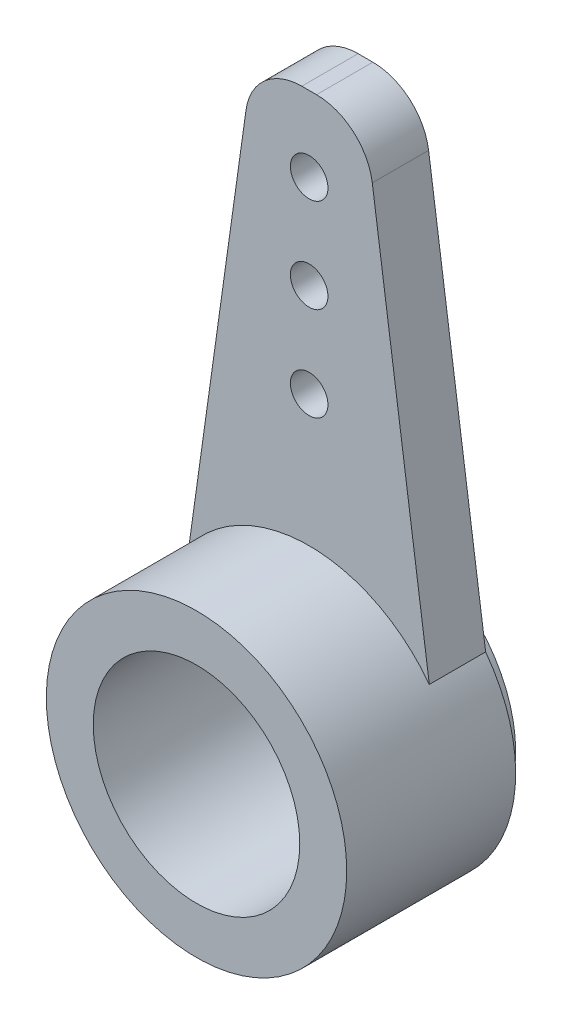
ISO-10303-21;
HEADER;
FILE_DESCRIPTION(('STEP AP214'),'2;1');
FILE_NAME('part.step','',(''),(''),'','','');
FILE_SCHEMA(('AUTOMOTIVE_DESIGN { 1 0 10303 214 1 1 1 1 }'));
ENDSEC;
DATA;
#1=APPLICATION_CONTEXT('core data for automotive mechanical design processes');
#2=APPLICATION_PROTOCOL_DEFINITION('international standard','automotive_design',2000,#1);
#3=PRODUCT_CONTEXT('',#1,'mechanical');
#4=PRODUCT('Part','Part','',(#3));
#5=PRODUCT_RELATED_PRODUCT_CATEGORY('part','',(#4));
#6=PRODUCT_DEFINITION_FORMATION('','',#4);
#7=PRODUCT_DEFINITION_CONTEXT('part definition',#1,'design');
#8=PRODUCT_DEFINITION('design','',#6,#7);
#9=PRODUCT_DEFINITION_SHAPE('','',#8);
#10=(LENGTH_UNIT() NAMED_UNIT(*) SI_UNIT(.MILLI.,.METRE.));
#11=(NAMED_UNIT(*) PLANE_ANGLE_UNIT() SI_UNIT($,.RADIAN.));
#12=(NAMED_UNIT(*) SI_UNIT($,.STERADIAN.) SOLID_ANGLE_UNIT());
#13=UNCERTAINTY_MEASURE_WITH_UNIT(LENGTH_MEASURE(1.E-05),#10,'distance_accuracy_value','');
#14=(GEOMETRIC_REPRESENTATION_CONTEXT(3) GLOBAL_UNCERTAINTY_ASSIGNED_CONTEXT((#13)) GLOBAL_UNIT_ASSIGNED_CONTEXT((#10,
#11,#12)) REPRESENTATION_CONTEXT('',''));
#15=CARTESIAN_POINT('',(0.,0.,0.));
#16=DIRECTION('',(0.,0.,1.));
#17=DIRECTION('',(1.,0.,0.));
#18=AXIS2_PLACEMENT_3D('',#15,#16,#17);
#19=CARTESIAN_POINT('',(0.,0.,1.5));
#20=DIRECTION('',(0.,0.,-1.));
#21=DIRECTION('',(-1.,0.,0.));
#22=AXIS2_PLACEMENT_3D('',#19,#20,#21);
#23=CYLINDRICAL_SURFACE('',#22,1.5);
#24=CARTESIAN_POINT('',(0.,0.,0.));
#25=DIRECTION('',(0.,0.,1.));
#26=DIRECTION('',(1.,0.,0.));
#27=AXIS2_PLACEMENT_3D('',#24,#25,#26);
#28=CIRCLE('',#27,1.5);
#29=CARTESIAN_POINT('',(1.5,0.,0.));
#30=VERTEX_POINT('',#29);
#31=EDGE_CURVE('E122',#30,#30,#28,.T.);
#32=ORIENTED_EDGE('',*,*,#31,.F.);
#33=EDGE_LOOP('',(#32));
#34=FACE_BOUND('',#33,.T.);
#35=CARTESIAN_POINT('',(0.,0.,0.5));
#36=DIRECTION('',(0.,0.,1.));
#37=DIRECTION('',(1.,0.,0.));
#38=AXIS2_PLACEMENT_3D('',#35,#36,#37);
#39=CIRCLE('',#38,1.5);
#40=CARTESIAN_POINT('',(1.5,0.,0.5));
#41=VERTEX_POINT('',#40);
#42=EDGE_CURVE('E36',#41,#41,#39,.T.);
#43=ORIENTED_EDGE('',*,*,#42,.T.);
#44=EDGE_LOOP('',(#43));
#45=FACE_BOUND('',#44,.T.);
#46=ADVANCED_FACE('F32',(#34,#45),#23,.F.);
#47=CARTESIAN_POINT('',(0.,0.,1.5));
#48=DIRECTION('',(0.,0.,1.));
#49=DIRECTION('',(1.,0.,0.));
#50=AXIS2_PLACEMENT_3D('',#47,#48,#49);
#51=PLANE('',#50);
#52=CARTESIAN_POINT('',(0.,0.,1.5));
#53=DIRECTION('',(0.,0.,1.));
#54=DIRECTION('',(1.,0.,0.));
#55=AXIS2_PLACEMENT_3D('',#52,#53,#54);
#56=CIRCLE('',#55,4.);
#57=CARTESIAN_POINT('',(3.2,2.4,1.5));
#58=VERTEX_POINT('',#57);
#59=CARTESIAN_POINT('',(-3.2,2.4,1.5));
#60=VERTEX_POINT('',#59);
#61=EDGE_CURVE('E172',#58,#60,#56,.T.);
#62=ORIENTED_EDGE('',*,*,#61,.F.);
#63=DIRECTION('',(-0.139129433730637,0.99027420478865,0.));
#64=VECTOR('',#63,1.);
#65=CARTESIAN_POINT('',(3.2,2.4,1.5));
#66=LINE('',#65,#64);
#67=CARTESIAN_POINT('',(1.68142313586669,13.2086941505959,1.5));
#68=VERTEX_POINT('',#67);
#69=EDGE_CURVE('E87',#58,#68,#66,.T.);
#70=ORIENTED_EDGE('',*,*,#69,.T.);
#71=CARTESIAN_POINT('',(0.196011828683711,13.,1.5));
#72=DIRECTION('',(0.,0.,1.));
#73=DIRECTION('',(1.,0.,0.));
#74=AXIS2_PLACEMENT_3D('',#71,#72,#73);
#75=CIRCLE('',#74,1.5);
#76=CARTESIAN_POINT('',(0.196011828683702,14.5,1.5));
#77=VERTEX_POINT('',#76);
#78=EDGE_CURVE('E100',#68,#77,#75,.T.);
#79=ORIENTED_EDGE('',*,*,#78,.T.);
#80=DIRECTION('',(-1.,0.,0.));
#81=VECTOR('',#80,1.);
#82=CARTESIAN_POINT('',(-0.196011828683702,14.5,1.5));
#83=LINE('',#82,#81);
#84=CARTESIAN_POINT('',(-0.196011828683702,14.5,1.5));
#85=VERTEX_POINT('',#84);
#86=EDGE_CURVE('E93',#77,#85,#83,.T.);
#87=ORIENTED_EDGE('',*,*,#86,.T.);
#88=CARTESIAN_POINT('',(-0.196011828683711,13.,1.5));
#89=DIRECTION('',(0.,0.,1.));
#90=DIRECTION('',(1.,0.,0.));
#91=AXIS2_PLACEMENT_3D('',#88,#89,#90);
#92=CIRCLE('',#91,1.5);
#93=CARTESIAN_POINT('',(-1.68142313586669,13.2086941505959,1.5));
#94=VERTEX_POINT('',#93);
#95=EDGE_CURVE('E98',#85,#94,#92,.T.);
#96=ORIENTED_EDGE('',*,*,#95,.T.);
#97=DIRECTION('',(-0.139129433730637,-0.99027420478865,0.));
#98=VECTOR('',#97,1.);
#99=CARTESIAN_POINT('',(-3.2,2.4,1.5));
#100=LINE('',#99,#98);
#101=EDGE_CURVE('E50',#94,#60,#100,.T.);
#102=ORIENTED_EDGE('',*,*,#101,.T.);
#103=EDGE_LOOP('',(#62,#70,#79,#87,#96,#102));
#104=FACE_BOUND('',#103,.T.);
#105=CARTESIAN_POINT('',(0.,12.5,1.5));
#106=DIRECTION('',(0.,0.,1.));
#107=DIRECTION('',(1.,0.,0.));
#108=AXIS2_PLACEMENT_3D('',#105,#106,#107);
#109=CIRCLE('',#108,0.5);
#110=CARTESIAN_POINT('',(0.5,12.5,1.5));
#111=VERTEX_POINT('',#110);
#112=EDGE_CURVE('E157',#111,#111,#109,.T.);
#113=ORIENTED_EDGE('',*,*,#112,.F.);
#114=EDGE_LOOP('',(#113));
#115=FACE_BOUND('',#114,.T.);
#116=CARTESIAN_POINT('',(0.,10.,1.5));
#117=DIRECTION('',(0.,0.,1.));
#118=DIRECTION('',(1.,0.,0.));
#119=AXIS2_PLACEMENT_3D('',#116,#117,#118);
#120=CIRCLE('',#119,0.5);
#121=CARTESIAN_POINT('',(0.5,10.,1.5));
#122=VERTEX_POINT('',#121);
#123=EDGE_CURVE('E153',#122,#122,#120,.T.);
#124=ORIENTED_EDGE('',*,*,#123,.F.);
#125=EDGE_LOOP('',(#124));
#126=FACE_BOUND('',#125,.T.);
#127=CARTESIAN_POINT('',(0.,7.5,1.5));
#128=DIRECTION('',(0.,0.,1.));
#129=DIRECTION('',(1.,0.,0.));
#130=AXIS2_PLACEMENT_3D('',#127,#128,#129);
#131=CIRCLE('',#130,0.5);
#132=CARTESIAN_POINT('',(0.5,7.5,1.5));
#133=VERTEX_POINT('',#132);
#134=EDGE_CURVE('E163',#133,#133,#131,.T.);
#135=ORIENTED_EDGE('',*,*,#134,.F.);
#136=EDGE_LOOP('',(#135));
#137=FACE_BOUND('',#136,.T.);
#138=ADVANCED_FACE('F95',(#104,#115,#126,#137),#51,.T.);
#139=CARTESIAN_POINT('',(0.,0.,0.));
#140=DIRECTION('',(0.,0.,1.));
#141=DIRECTION('',(1.,0.,0.));
#142=AXIS2_PLACEMENT_3D('',#139,#140,#141);
#143=PLANE('',#142);
#144=CARTESIAN_POINT('',(0.,0.,0.));
#145=DIRECTION('',(0.,0.,1.));
#146=DIRECTION('',(1.,0.,0.));
#147=AXIS2_PLACEMENT_3D('',#144,#145,#146);
#148=CIRCLE('',#147,3.5);
#149=CARTESIAN_POINT('',(3.5,0.,0.));
#150=VERTEX_POINT('',#149);
#151=EDGE_CURVE('E11',#150,#150,#148,.F.);
#152=ORIENTED_EDGE('',*,*,#151,.F.);
#153=EDGE_LOOP('',(#152));
#154=FACE_BOUND('',#153,.T.);
#155=CARTESIAN_POINT('',(0.,0.,0.));
#156=DIRECTION('',(0.,0.,1.));
#157=DIRECTION('',(1.,0.,0.));
#158=AXIS2_PLACEMENT_3D('',#155,#156,#157);
#159=CIRCLE('',#158,4.);
#160=CARTESIAN_POINT('',(-3.2,2.4,0.));
#161=VERTEX_POINT('',#160);
#162=CARTESIAN_POINT('',(3.2,2.4,0.));
#163=VERTEX_POINT('',#162);
#164=EDGE_CURVE('E118',#161,#163,#159,.T.);
#165=ORIENTED_EDGE('',*,*,#164,.F.);
#166=DIRECTION('',(-0.139129433730637,-0.99027420478865,0.));
#167=VECTOR('',#166,1.);
#168=CARTESIAN_POINT('',(-3.2,2.4,0.));
#169=LINE('',#168,#167);
#170=CARTESIAN_POINT('',(-1.68142313586669,13.2086941505959,0.));
#171=VERTEX_POINT('',#170);
#172=EDGE_CURVE('E80',#171,#161,#169,.T.);
#173=ORIENTED_EDGE('',*,*,#172,.F.);
#174=CARTESIAN_POINT('',(-0.196011828683711,13.,0.));
#175=DIRECTION('',(0.,0.,1.));
#176=DIRECTION('',(1.,0.,0.));
#177=AXIS2_PLACEMENT_3D('',#174,#175,#176);
#178=CIRCLE('',#177,1.5);
#179=CARTESIAN_POINT('',(-0.196011828683702,14.5,0.));
#180=VERTEX_POINT('',#179);
#181=EDGE_CURVE('E74',#180,#171,#178,.T.);
#182=ORIENTED_EDGE('',*,*,#181,.F.);
#183=DIRECTION('',(-1.,0.,0.));
#184=VECTOR('',#183,1.);
#185=CARTESIAN_POINT('',(-0.196011828683702,14.5,0.));
#186=LINE('',#185,#184);
#187=CARTESIAN_POINT('',(0.196011828683702,14.5,0.));
#188=VERTEX_POINT('',#187);
#189=EDGE_CURVE('E108',#188,#180,#186,.T.);
#190=ORIENTED_EDGE('',*,*,#189,.F.);
#191=CARTESIAN_POINT('',(0.196011828683711,13.,0.));
#192=DIRECTION('',(0.,0.,1.));
#193=DIRECTION('',(1.,0.,0.));
#194=AXIS2_PLACEMENT_3D('',#191,#192,#193);
#195=CIRCLE('',#194,1.5);
#196=CARTESIAN_POINT('',(1.68142313586669,13.2086941505959,0.));
#197=VERTEX_POINT('',#196);
#198=EDGE_CURVE('E124',#197,#188,#195,.T.);
#199=ORIENTED_EDGE('',*,*,#198,.F.);
#200=DIRECTION('',(-0.139129433730637,0.99027420478865,0.));
#201=VECTOR('',#200,1.);
#202=CARTESIAN_POINT('',(3.2,2.4,0.));
#203=LINE('',#202,#201);
#204=EDGE_CURVE('E121',#163,#197,#203,.T.);
#205=ORIENTED_EDGE('',*,*,#204,.F.);
#206=EDGE_LOOP('',(#165,#173,#182,#190,#199,#205));
#207=FACE_BOUND('',#206,.T.);
#208=CARTESIAN_POINT('',(0.,10.,0.));
#209=DIRECTION('',(0.,0.,1.));
#210=DIRECTION('',(1.,0.,0.));
#211=AXIS2_PLACEMENT_3D('',#208,#209,#210);
#212=CIRCLE('',#211,0.5);
#213=CARTESIAN_POINT('',(0.5,10.,0.));
#214=VERTEX_POINT('',#213);
#215=EDGE_CURVE('E154',#214,#214,#212,.T.);
#216=ORIENTED_EDGE('',*,*,#215,.T.);
#217=EDGE_LOOP('',(#216));
#218=FACE_BOUND('',#217,.T.);
#219=CARTESIAN_POINT('',(0.,12.5,0.));
#220=DIRECTION('',(0.,0.,1.));
#221=DIRECTION('',(1.,0.,0.));
#222=AXIS2_PLACEMENT_3D('',#219,#220,#221);
#223=CIRCLE('',#222,0.5);
#224=CARTESIAN_POINT('',(0.5,12.5,0.));
#225=VERTEX_POINT('',#224);
#226=EDGE_CURVE('E160',#225,#225,#223,.T.);
#227=ORIENTED_EDGE('',*,*,#226,.T.);
#228=EDGE_LOOP('',(#227));
#229=FACE_BOUND('',#228,.T.);
#230=CARTESIAN_POINT('',(0.,7.5,0.));
#231=DIRECTION('',(0.,0.,1.));
#232=DIRECTION('',(1.,0.,0.));
#233=AXIS2_PLACEMENT_3D('',#230,#231,#232);
#234=CIRCLE('',#233,0.5);
#235=CARTESIAN_POINT('',(0.5,7.5,0.));
#236=VERTEX_POINT('',#235);
#237=EDGE_CURVE('E166',#236,#236,#234,.T.);
#238=ORIENTED_EDGE('',*,*,#237,.T.);
#239=EDGE_LOOP('',(#238));
#240=FACE_BOUND('',#239,.T.);
#241=ADVANCED_FACE('F144',(#154,#207,#218,#229,#240),#143,.F.);
#242=CARTESIAN_POINT('',(0.,0.,1.5));
#243=DIRECTION('',(0.,0.,-1.));
#244=DIRECTION('',(-1.,0.,0.));
#245=AXIS2_PLACEMENT_3D('',#242,#243,#244);
#246=CYLINDRICAL_SURFACE('',#245,4.);
#247=ORIENTED_EDGE('',*,*,#164,.T.);
#248=DIRECTION('',(0.,0.,-1.));
#249=VECTOR('',#248,1.);
#250=CARTESIAN_POINT('',(3.2,2.4,1.5));
#251=LINE('',#250,#249);
#252=EDGE_CURVE('E42',#58,#163,#251,.T.);
#253=ORIENTED_EDGE('',*,*,#252,.F.);
#254=ORIENTED_EDGE('',*,*,#61,.T.);
#255=DIRECTION('',(0.,0.,-1.));
#256=VECTOR('',#255,1.);
#257=CARTESIAN_POINT('',(-3.2,2.4,1.5));
#258=LINE('',#257,#256);
#259=EDGE_CURVE('E114',#60,#161,#258,.T.);
#260=ORIENTED_EDGE('',*,*,#259,.T.);
#261=EDGE_LOOP('',(#247,#253,#254,#260));
#262=FACE_BOUND('',#261,.T.);
#263=CARTESIAN_POINT('',(0.,0.,4.5));
#264=DIRECTION('',(0.,0.,1.));
#265=DIRECTION('',(1.,0.,0.));
#266=AXIS2_PLACEMENT_3D('',#263,#264,#265);
#267=CIRCLE('',#266,4.);
#268=CARTESIAN_POINT('',(4.,0.,4.5));
#269=VERTEX_POINT('',#268);
#270=EDGE_CURVE('E169',#269,#269,#267,.T.);
#271=ORIENTED_EDGE('',*,*,#270,.F.);
#272=EDGE_LOOP('',(#271));
#273=FACE_BOUND('',#272,.T.);
#274=ADVANCED_FACE('F34',(#262,#273),#246,.T.);
#275=CARTESIAN_POINT('',(3.2,2.4,1.5));
#276=DIRECTION('',(-0.99027420478865,-0.139129433730637,0.));
#277=DIRECTION('',(0.139129433730637,-0.99027420478865,0.));
#278=AXIS2_PLACEMENT_3D('',#275,#276,#277);
#279=PLANE('',#278);
#280=ORIENTED_EDGE('',*,*,#204,.T.);
#281=DIRECTION('',(0.,0.,-1.));
#282=VECTOR('',#281,1.);
#283=CARTESIAN_POINT('',(1.68142313586669,13.2086941505959,1.5));
#284=LINE('',#283,#282);
#285=EDGE_CURVE('E132',#68,#197,#284,.T.);
#286=ORIENTED_EDGE('',*,*,#285,.F.);
#287=ORIENTED_EDGE('',*,*,#69,.F.);
#288=ORIENTED_EDGE('',*,*,#252,.T.);
#289=EDGE_LOOP('',(#280,#286,#287,#288));
#290=FACE_BOUND('',#289,.T.);
#291=ADVANCED_FACE('F138',(#290),#279,.F.);
#292=CARTESIAN_POINT('',(0.196011828683711,13.,1.5));
#293=DIRECTION('',(0.,0.,-1.));
#294=DIRECTION('',(-1.,0.,0.));
#295=AXIS2_PLACEMENT_3D('',#292,#293,#294);
#296=CYLINDRICAL_SURFACE('',#295,1.5);
#297=ORIENTED_EDGE('',*,*,#198,.T.);
#298=DIRECTION('',(0.,0.,-1.));
#299=VECTOR('',#298,1.);
#300=CARTESIAN_POINT('',(0.196011828683702,14.5,1.5));
#301=LINE('',#300,#299);
#302=EDGE_CURVE('E109',#77,#188,#301,.T.);
#303=ORIENTED_EDGE('',*,*,#302,.F.);
#304=ORIENTED_EDGE('',*,*,#78,.F.);
#305=ORIENTED_EDGE('',*,*,#285,.T.);
#306=EDGE_LOOP('',(#297,#303,#304,#305));
#307=FACE_BOUND('',#306,.T.);
#308=ADVANCED_FACE('F148',(#307),#296,.T.);
#309=CARTESIAN_POINT('',(-0.196011828683702,14.5,1.5));
#310=DIRECTION('',(0.,-1.,0.));
#311=DIRECTION('',(0.,0.,-1.));
#312=AXIS2_PLACEMENT_3D('',#309,#310,#311);
#313=PLANE('',#312);
#314=ORIENTED_EDGE('',*,*,#189,.T.);
#315=DIRECTION('',(0.,0.,-1.));
#316=VECTOR('',#315,1.);
#317=CARTESIAN_POINT('',(-0.196011828683702,14.5,1.5));
#318=LINE('',#317,#316);
#319=EDGE_CURVE('E105',#85,#180,#318,.T.);
#320=ORIENTED_EDGE('',*,*,#319,.F.);
#321=ORIENTED_EDGE('',*,*,#86,.F.);
#322=ORIENTED_EDGE('',*,*,#302,.T.);
#323=EDGE_LOOP('',(#314,#320,#321,#322));
#324=FACE_BOUND('',#323,.T.);
#325=ADVANCED_FACE('F106',(#324),#313,.F.);
#326=CARTESIAN_POINT('',(-0.196011828683711,13.,1.5));
#327=DIRECTION('',(0.,0.,-1.));
#328=DIRECTION('',(-1.,0.,0.));
#329=AXIS2_PLACEMENT_3D('',#326,#327,#328);
#330=CYLINDRICAL_SURFACE('',#329,1.5);
#331=ORIENTED_EDGE('',*,*,#181,.T.);
#332=DIRECTION('',(0.,0.,-1.));
#333=VECTOR('',#332,1.);
#334=CARTESIAN_POINT('',(-1.68142313586669,13.2086941505959,1.5));
#335=LINE('',#334,#333);
#336=EDGE_CURVE('E110',#94,#171,#335,.T.);
#337=ORIENTED_EDGE('',*,*,#336,.F.);
#338=ORIENTED_EDGE('',*,*,#95,.F.);
#339=ORIENTED_EDGE('',*,*,#319,.T.);
#340=EDGE_LOOP('',(#331,#337,#338,#339));
#341=FACE_BOUND('',#340,.T.);
#342=ADVANCED_FACE('F112',(#341),#330,.T.);
#343=CARTESIAN_POINT('',(-3.2,2.4,1.5));
#344=DIRECTION('',(0.99027420478865,-0.139129433730637,0.));
#345=DIRECTION('',(0.139129433730637,0.99027420478865,0.));
#346=AXIS2_PLACEMENT_3D('',#343,#344,#345);
#347=PLANE('',#346);
#348=ORIENTED_EDGE('',*,*,#172,.T.);
#349=ORIENTED_EDGE('',*,*,#259,.F.);
#350=ORIENTED_EDGE('',*,*,#101,.F.);
#351=ORIENTED_EDGE('',*,*,#336,.T.);
#352=EDGE_LOOP('',(#348,#349,#350,#351));
#353=FACE_BOUND('',#352,.T.);
#354=ADVANCED_FACE('F221',(#353),#347,.F.);
#355=CARTESIAN_POINT('',(0.,10.,1.5));
#356=DIRECTION('',(0.,0.,-1.));
#357=DIRECTION('',(-1.,0.,0.));
#358=AXIS2_PLACEMENT_3D('',#355,#356,#357);
#359=CYLINDRICAL_SURFACE('',#358,0.5);
#360=ORIENTED_EDGE('',*,*,#123,.T.);
#361=EDGE_LOOP('',(#360));
#362=FACE_BOUND('',#361,.T.);
#363=ORIENTED_EDGE('',*,*,#215,.F.);
#364=EDGE_LOOP('',(#363));
#365=FACE_BOUND('',#364,.T.);
#366=ADVANCED_FACE('F215',(#362,#365),#359,.F.);
#367=CARTESIAN_POINT('',(0.,12.5,1.5));
#368=DIRECTION('',(0.,0.,-1.));
#369=DIRECTION('',(-1.,0.,0.));
#370=AXIS2_PLACEMENT_3D('',#367,#368,#369);
#371=CYLINDRICAL_SURFACE('',#370,0.5);
#372=ORIENTED_EDGE('',*,*,#112,.T.);
#373=EDGE_LOOP('',(#372));
#374=FACE_BOUND('',#373,.T.);
#375=ORIENTED_EDGE('',*,*,#226,.F.);
#376=EDGE_LOOP('',(#375));
#377=FACE_BOUND('',#376,.T.);
#378=ADVANCED_FACE('F256',(#374,#377),#371,.F.);
#379=CARTESIAN_POINT('',(0.,7.5,1.5));
#380=DIRECTION('',(0.,0.,-1.));
#381=DIRECTION('',(-1.,0.,0.));
#382=AXIS2_PLACEMENT_3D('',#379,#380,#381);
#383=CYLINDRICAL_SURFACE('',#382,0.5);
#384=ORIENTED_EDGE('',*,*,#134,.T.);
#385=EDGE_LOOP('',(#384));
#386=FACE_BOUND('',#385,.T.);
#387=ORIENTED_EDGE('',*,*,#237,.F.);
#388=EDGE_LOOP('',(#387));
#389=FACE_BOUND('',#388,.T.);
#390=ADVANCED_FACE('F250',(#386,#389),#383,.F.);
#391=CARTESIAN_POINT('',(0.,0.,4.5));
#392=DIRECTION('',(0.,0.,1.));
#393=DIRECTION('',(1.,0.,0.));
#394=AXIS2_PLACEMENT_3D('',#391,#392,#393);
#395=PLANE('',#394);
#396=CARTESIAN_POINT('',(0.,0.,4.5));
#397=DIRECTION('',(0.,0.,1.));
#398=DIRECTION('',(1.,0.,0.));
#399=AXIS2_PLACEMENT_3D('',#396,#397,#398);
#400=CIRCLE('',#399,2.75);
#401=CARTESIAN_POINT('',(2.75,0.,4.5));
#402=VERTEX_POINT('',#401);
#403=EDGE_CURVE('E185',#402,#402,#400,.T.);
#404=ORIENTED_EDGE('',*,*,#403,.F.);
#405=EDGE_LOOP('',(#404));
#406=FACE_BOUND('',#405,.T.);
#407=ORIENTED_EDGE('',*,*,#270,.T.);
#408=EDGE_LOOP('',(#407));
#409=FACE_BOUND('',#408,.T.);
#410=ADVANCED_FACE('F255',(#406,#409),#395,.T.);
#411=CARTESIAN_POINT('',(0.,0.,-0.5));
#412=DIRECTION('',(0.,0.,-1.));
#413=DIRECTION('',(-1.,0.,0.));
#414=AXIS2_PLACEMENT_3D('',#411,#412,#413);
#415=PLANE('',#414);
#416=CARTESIAN_POINT('',(0.,0.,-0.5));
#417=DIRECTION('',(0.,0.,-1.));
#418=DIRECTION('',(-1.,0.,0.));
#419=AXIS2_PLACEMENT_3D('',#416,#417,#418);
#420=CIRCLE('',#419,3.5);
#421=CARTESIAN_POINT('',(-3.5,0.,-0.5));
#422=VERTEX_POINT('',#421);
#423=EDGE_CURVE('E174',#422,#422,#420,.T.);
#424=ORIENTED_EDGE('',*,*,#423,.T.);
#425=EDGE_LOOP('',(#424));
#426=FACE_BOUND('',#425,.T.);
#427=CARTESIAN_POINT('',(0.,0.,-0.5));
#428=DIRECTION('',(0.,0.,-1.));
#429=DIRECTION('',(-1.,0.,0.));
#430=AXIS2_PLACEMENT_3D('',#427,#428,#429);
#431=CIRCLE('',#430,3.25);
#432=CARTESIAN_POINT('',(-3.25,0.,-0.5));
#433=VERTEX_POINT('',#432);
#434=EDGE_CURVE('E179',#433,#433,#431,.T.);
#435=ORIENTED_EDGE('',*,*,#434,.F.);
#436=EDGE_LOOP('',(#435));
#437=FACE_BOUND('',#436,.T.);
#438=ADVANCED_FACE('F313',(#426,#437),#415,.T.);
#439=CARTESIAN_POINT('',(0.,0.,-0.5));
#440=DIRECTION('',(0.,0.,1.));
#441=DIRECTION('',(1.,0.,0.));
#442=AXIS2_PLACEMENT_3D('',#439,#440,#441);
#443=CYLINDRICAL_SURFACE('',#442,3.5);
#444=ORIENTED_EDGE('',*,*,#423,.F.);
#445=EDGE_LOOP('',(#444));
#446=FACE_BOUND('',#445,.T.);
#447=ORIENTED_EDGE('',*,*,#151,.T.);
#448=EDGE_LOOP('',(#447));
#449=FACE_BOUND('',#448,.T.);
#450=ADVANCED_FACE('F331',(#446,#449),#443,.T.);
#451=CARTESIAN_POINT('',(0.,0.,-0.5));
#452=DIRECTION('',(0.,0.,1.));
#453=DIRECTION('',(1.,0.,0.));
#454=AXIS2_PLACEMENT_3D('',#451,#452,#453);
#455=CYLINDRICAL_SURFACE('',#454,3.25);
#456=ORIENTED_EDGE('',*,*,#434,.T.);
#457=EDGE_LOOP('',(#456));
#458=FACE_BOUND('',#457,.T.);
#459=CARTESIAN_POINT('',(0.,0.,0.));
#460=DIRECTION('',(0.,0.,-1.));
#461=DIRECTION('',(-1.,0.,0.));
#462=AXIS2_PLACEMENT_3D('',#459,#460,#461);
#463=CIRCLE('',#462,3.25);
#464=CARTESIAN_POINT('',(-3.25,0.,0.));
#465=VERTEX_POINT('',#464);
#466=EDGE_CURVE('E180',#465,#465,#463,.T.);
#467=ORIENTED_EDGE('',*,*,#466,.F.);
#468=EDGE_LOOP('',(#467));
#469=FACE_BOUND('',#468,.T.);
#470=ADVANCED_FACE('F323',(#458,#469),#455,.F.);
#471=ORIENTED_EDGE('',*,*,#31,.T.);
#472=EDGE_LOOP('',(#471));
#473=FACE_BOUND('',#472,.T.);
#474=ORIENTED_EDGE('',*,*,#466,.T.);
#475=EDGE_LOOP('',(#474));
#476=FACE_BOUND('',#475,.T.);
#477=ADVANCED_FACE('F203',(#473,#476),#143,.F.);
#478=CARTESIAN_POINT('',(0.,0.,0.5));
#479=DIRECTION('',(0.,0.,1.));
#480=DIRECTION('',(1.,0.,0.));
#481=AXIS2_PLACEMENT_3D('',#478,#479,#480);
#482=CYLINDRICAL_SURFACE('',#481,2.75);
#483=CARTESIAN_POINT('',(0.,0.,0.5));
#484=DIRECTION('',(0.,0.,1.));
#485=DIRECTION('',(1.,0.,0.));
#486=AXIS2_PLACEMENT_3D('',#483,#484,#485);
#487=CIRCLE('',#486,2.75);
#488=CARTESIAN_POINT('',(2.75,0.,0.5));
#489=VERTEX_POINT('',#488);
#490=EDGE_CURVE('E188',#489,#489,#487,.T.);
#491=ORIENTED_EDGE('',*,*,#490,.F.);
#492=EDGE_LOOP('',(#491));
#493=FACE_BOUND('',#492,.T.);
#494=ORIENTED_EDGE('',*,*,#403,.T.);
#495=EDGE_LOOP('',(#494));
#496=FACE_BOUND('',#495,.T.);
#497=ADVANCED_FACE('F198',(#493,#496),#482,.F.);
#498=CARTESIAN_POINT('',(0.,0.,0.5));
#499=DIRECTION('',(0.,0.,1.));
#500=DIRECTION('',(1.,0.,0.));
#501=AXIS2_PLACEMENT_3D('',#498,#499,#500);
#502=PLANE('',#501);
#503=ORIENTED_EDGE('',*,*,#42,.F.);
#504=EDGE_LOOP('',(#503));
#505=FACE_BOUND('',#504,.T.);
#506=ORIENTED_EDGE('',*,*,#490,.T.);
#507=EDGE_LOOP('',(#506));
#508=FACE_BOUND('',#507,.T.);
#509=ADVANCED_FACE('F196',(#505,#508),#502,.T.);
#510=CLOSED_SHELL('',(#46,#138,#241,#274,#291,#308,#325,#342,#354,#366,#378,#390,#410,#438,#450,
#470,#477,#497,#509));
#511=MANIFOLD_SOLID_BREP('B2',#510);
#512=ADVANCED_BREP_SHAPE_REPRESENTATION('',(#18,#511),#14);
#513=SHAPE_DEFINITION_REPRESENTATION(#9,#512);
ENDSEC;
END-ISO-10303-21;
